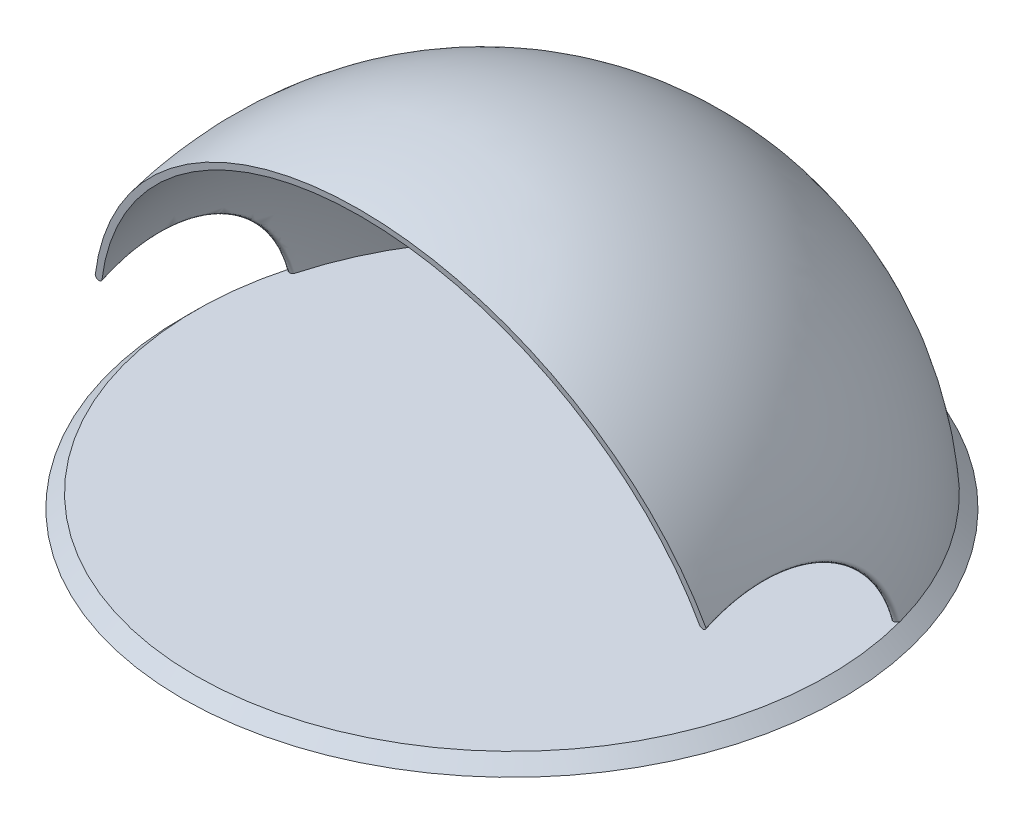
ISO-10303-21;
HEADER;
FILE_DESCRIPTION(('STEP AP214'),'2;1');
FILE_NAME('part.step','',(''),(''),'','','');
FILE_SCHEMA(('AUTOMOTIVE_DESIGN { 1 0 10303 214 1 1 1 1 }'));
ENDSEC;
DATA;
#1=APPLICATION_CONTEXT('core data for automotive mechanical design processes');
#2=APPLICATION_PROTOCOL_DEFINITION('international standard','automotive_design',2000,#1);
#3=PRODUCT_CONTEXT('',#1,'mechanical');
#4=PRODUCT('Part','Part','',(#3));
#5=PRODUCT_RELATED_PRODUCT_CATEGORY('part','',(#4));
#6=PRODUCT_DEFINITION_FORMATION('','',#4);
#7=PRODUCT_DEFINITION_CONTEXT('part definition',#1,'design');
#8=PRODUCT_DEFINITION('design','',#6,#7);
#9=PRODUCT_DEFINITION_SHAPE('','',#8);
#10=(LENGTH_UNIT() NAMED_UNIT(*) SI_UNIT(.MILLI.,.METRE.));
#11=(NAMED_UNIT(*) PLANE_ANGLE_UNIT() SI_UNIT($,.RADIAN.));
#12=(NAMED_UNIT(*) SI_UNIT($,.STERADIAN.) SOLID_ANGLE_UNIT());
#13=UNCERTAINTY_MEASURE_WITH_UNIT(LENGTH_MEASURE(1.E-05),#10,'distance_accuracy_value','');
#14=(GEOMETRIC_REPRESENTATION_CONTEXT(3) GLOBAL_UNCERTAINTY_ASSIGNED_CONTEXT((#13)) GLOBAL_UNIT_ASSIGNED_CONTEXT((#10,
#11,#12)) REPRESENTATION_CONTEXT('',''));
#15=CARTESIAN_POINT('',(0.,0.,0.));
#16=DIRECTION('',(0.,0.,1.));
#17=DIRECTION('',(1.,0.,0.));
#18=AXIS2_PLACEMENT_3D('',#15,#16,#17);
#19=CARTESIAN_POINT('',(0.,20.,0.));
#20=DIRECTION('',(0.,1.,0.));
#21=DIRECTION('',(0.,0.,1.));
#22=AXIS2_PLACEMENT_3D('',#19,#20,#21);
#23=PLANE('',#22);
#24=CARTESIAN_POINT('',(-458.072342239549,20.,-125.677083333333));
#25=DIRECTION('',(0.,1.,0.));
#26=DIRECTION('',(0.,0.,1.));
#27=AXIS2_PLACEMENT_3D('',#24,#25,#26);
#28=CIRCLE('',#27,5.00000000000003);
#29=CARTESIAN_POINT('',(-462.894156368386,20.,-127.));
#30=VERTEX_POINT('',#29);
#31=CARTESIAN_POINT('',(-453.250528110711,20.,-124.354166666667));
#32=VERTEX_POINT('',#31);
#33=EDGE_CURVE('E52',#30,#32,#28,.T.);
#34=ORIENTED_EDGE('',*,*,#33,.F.);
#35=CARTESIAN_POINT('',(0.,20.,0.));
#36=DIRECTION('',(0.,1.,0.));
#37=DIRECTION('',(0.,0.,1.));
#38=AXIS2_PLACEMENT_3D('',#35,#36,#37);
#39=CIRCLE('',#38,480.);
#40=CARTESIAN_POINT('',(462.894156368386,20.,-127.));
#41=VERTEX_POINT('',#40);
#42=EDGE_CURVE('E41',#30,#41,#39,.T.);
#43=ORIENTED_EDGE('',*,*,#42,.T.);
#44=CARTESIAN_POINT('',(458.072342239549,20.,-125.677083333333));
#45=DIRECTION('',(0.,1.,0.));
#46=DIRECTION('',(0.,0.,-1.));
#47=AXIS2_PLACEMENT_3D('',#44,#45,#46);
#48=CIRCLE('',#47,5.00000000000001);
#49=CARTESIAN_POINT('',(453.250528110711,20.,-124.354166666667));
#50=VERTEX_POINT('',#49);
#51=EDGE_CURVE('E88',#50,#41,#48,.T.);
#52=ORIENTED_EDGE('',*,*,#51,.F.);
#53=CARTESIAN_POINT('',(0.,20.,0.));
#54=DIRECTION('',(0.,-1.,0.));
#55=DIRECTION('',(0.,0.,-1.));
#56=AXIS2_PLACEMENT_3D('',#53,#54,#55);
#57=CIRCLE('',#56,470.);
#58=EDGE_CURVE('E48',#32,#50,#57,.T.);
#59=ORIENTED_EDGE('',*,*,#58,.F.);
#60=EDGE_LOOP('',(#34,#43,#52,#59));
#61=FACE_BOUND('',#60,.T.);
#62=ADVANCED_FACE('F33',(#61),#23,.T.);
#63=CARTESIAN_POINT('',(0.,0.,0.));
#64=DIRECTION('',(0.,-1.,0.));
#65=DIRECTION('',(0.,0.,1.));
#66=AXIS2_PLACEMENT_3D('',#63,#64,#65);
#67=CONICAL_SURFACE('',#66,500.,0.78539816339745);
#68=EDGE_CURVE('E11',#41,#30,#39,.T.);
#69=ORIENTED_EDGE('',*,*,#68,.F.);
#70=ORIENTED_EDGE('',*,*,#42,.F.);
#71=EDGE_LOOP('',(#69,#70));
#72=FACE_BOUND('',#71,.T.);
#73=CARTESIAN_POINT('',(0.,0.,0.));
#74=DIRECTION('',(0.,1.,0.));
#75=DIRECTION('',(0.,0.,1.));
#76=AXIS2_PLACEMENT_3D('',#73,#74,#75);
#77=CIRCLE('',#76,500.);
#78=CARTESIAN_POINT('',(0.,0.,500.));
#79=VERTEX_POINT('',#78);
#80=EDGE_CURVE('E83',#79,#79,#77,.T.);
#81=ORIENTED_EDGE('',*,*,#80,.T.);
#82=EDGE_LOOP('',(#81));
#83=FACE_BOUND('',#82,.T.);
#84=ADVANCED_FACE('F35',(#72,#83),#67,.T.);
#85=CARTESIAN_POINT('',(0.,0.,0.));
#86=DIRECTION('',(0.,1.,0.));
#87=DIRECTION('',(0.,0.,1.));
#88=AXIS2_PLACEMENT_3D('',#85,#86,#87);
#89=PLANE('',#88);
#90=ORIENTED_EDGE('',*,*,#80,.F.);
#91=EDGE_LOOP('',(#90));
#92=FACE_BOUND('',#91,.T.);
#93=ADVANCED_FACE('F101',(#92),#89,.F.);
#94=CARTESIAN_POINT('',(-229.036171119774,97.2845311127282,157.975073628956));
#95=DIRECTION('',(0.,-0.175115064149623,0.984547974609604));
#96=DIRECTION('',(0.,-0.984547974609604,-0.175115064149623));
#97=AXIS2_PLACEMENT_3D('',#94,#95,#96);
#98=PLANE('',#97);
#99=CARTESIAN_POINT('',(-458.072342239549,159.152090038066,168.979048883984));
#100=DIRECTION('',(0.,-0.175115064149623,0.984547974609604));
#101=DIRECTION('',(0.,-0.984547974609604,-0.175115064149623));
#102=AXIS2_PLACEMENT_3D('',#99,#100,#101);
#103=CIRCLE('',#102,5.00000000000003);
#104=CARTESIAN_POINT('',(-462.894156368386,160.45456496281,169.210711520932));
#105=VERTEX_POINT('',#104);
#106=CARTESIAN_POINT('',(-453.250528110711,157.849615113322,168.747386247036));
#107=VERTEX_POINT('',#106);
#108=EDGE_CURVE('E82',#105,#107,#103,.T.);
#109=ORIENTED_EDGE('',*,*,#108,.T.);
#110=CARTESIAN_POINT('',(0.,35.4169721873903,146.971098373929));
#111=DIRECTION('',(0.,0.175115064149623,-0.984547974609604));
#112=DIRECTION('',(0.,0.984547974609604,0.175115064149623));
#113=AXIS2_PLACEMENT_3D('',#110,#111,#112);
#114=CIRCLE('',#113,470.);
#115=CARTESIAN_POINT('',(453.250528110711,157.849615113322,168.747386247036));
#116=VERTEX_POINT('',#115);
#117=EDGE_CURVE('E77',#107,#116,#114,.T.);
#118=ORIENTED_EDGE('',*,*,#117,.T.);
#119=CARTESIAN_POINT('',(458.072342239549,159.152090038066,168.979048883984));
#120=DIRECTION('',(0.,-0.175115064149623,0.984547974609604));
#121=DIRECTION('',(0.,0.984547974609604,0.175115064149623));
#122=AXIS2_PLACEMENT_3D('',#119,#120,#121);
#123=CIRCLE('',#122,5.00000000000001);
#124=CARTESIAN_POINT('',(462.894156368386,160.45456496281,169.210711520932));
#125=VERTEX_POINT('',#124);
#126=EDGE_CURVE('E71',#116,#125,#123,.T.);
#127=ORIENTED_EDGE('',*,*,#126,.T.);
#128=CARTESIAN_POINT('',(0.,35.4169721873903,146.971098373929));
#129=DIRECTION('',(0.,-0.175115064149623,0.984547974609604));
#130=DIRECTION('',(0.,0.984547974609604,0.175115064149623));
#131=AXIS2_PLACEMENT_3D('',#128,#129,#130);
#132=CIRCLE('',#131,480.);
#133=EDGE_CURVE('E74',#125,#105,#132,.T.);
#134=ORIENTED_EDGE('',*,*,#133,.T.);
#135=EDGE_LOOP('',(#109,#118,#127,#134));
#136=FACE_BOUND('',#135,.T.);
#137=ADVANCED_FACE('F73',(#136),#98,.T.);
#138=CARTESIAN_POINT('',(462.894156368386,20.,-127.));
#139=CARTESIAN_POINT('',(462.894156368386,158.876701657731,-90.8554399731509));
#140=CARTESIAN_POINT('',(462.894156368386,220.360020850081,38.8093931311122));
#141=CARTESIAN_POINT('',(462.894156368386,160.45456496281,169.210711520932));
#142=CARTESIAN_POINT('',(302.710075009299,20.,-710.844686648501));
#143=CARTESIAN_POINT('',(302.710075009299,550.685309412867,-674.700126621652));
#144=CARTESIAN_POINT('',(302.710075009299,863.794714057857,-244.704978312947));
#145=CARTESIAN_POINT('',(302.710075009299,735.277668689171,271.450711276801));
#146=CARTESIAN_POINT('',(-302.710075009299,20.,-710.844686648501));
#147=CARTESIAN_POINT('',(-302.710075009299,550.685309412867,-674.700126621652));
#148=CARTESIAN_POINT('',(-302.710075009299,863.794714057857,-244.704978312947));
#149=CARTESIAN_POINT('',(-302.710075009299,735.277668689171,271.450711276801));
#150=CARTESIAN_POINT('',(-462.894156368386,20.,-127.));
#151=CARTESIAN_POINT('',(-462.894156368386,158.876701657731,-90.8554399731509));
#152=CARTESIAN_POINT('',(-462.894156368386,220.360020850081,38.8093931311122));
#153=CARTESIAN_POINT('',(-462.894156368386,160.45456496281,169.210711520932));
#154=CARTESIAN_POINT('',(-465.539989701719,20.,-117.356371742326));
#155=CARTESIAN_POINT('',(-465.539989701719,152.405020664901,-81.2118117154765));
#156=CARTESIAN_POINT('',(-465.539989701719,209.732117348884,43.492328963944));
#157=CARTESIAN_POINT('',(-465.539989701719,150.959950293829,167.521966939954));
#158=CARTESIAN_POINT('',(-455.896361444045,20.,-114.710538408992));
#159=CARTESIAN_POINT('',(-455.896361444045,150.629445244945,-78.5659783821432));
#160=CARTESIAN_POINT('',(-455.896361444045,206.816237495828,44.7771428735332));
#161=CARTESIAN_POINT('',(-455.896361444045,148.355000444341,167.058641666058));
#162=CARTESIAN_POINT('',(-453.250528110711,20.,-124.354166666667));
#163=CARTESIAN_POINT('',(-453.250528110711,157.101126237774,-88.2096066398176));
#164=CARTESIAN_POINT('',(-453.250528110711,217.444140997025,40.0942070407014));
#165=CARTESIAN_POINT('',(-453.250528110711,157.849615113322,168.747386247036));
#166=CARTESIAN_POINT('',(-296.403615113272,20.,-696.035422343324));
#167=CARTESIAN_POINT('',(-296.403615113272,540.747054664678,-659.890862316475));
#168=CARTESIAN_POINT('',(-296.403615113272,847.473944762972,-237.513614998273));
#169=CARTESIAN_POINT('',(-296.403615113272,720.69723751205,268.857386007991));
#170=CARTESIAN_POINT('',(296.403615113272,20.,-696.035422343324));
#171=CARTESIAN_POINT('',(296.403615113272,540.747054664678,-659.890862316475));
#172=CARTESIAN_POINT('',(296.403615113272,847.473944762972,-237.513614998274));
#173=CARTESIAN_POINT('',(296.403615113272,720.69723751205,268.857386007991));
#174=CARTESIAN_POINT('',(453.250528110711,20.,-124.354166666667));
#175=CARTESIAN_POINT('',(453.250528110711,157.101126237774,-88.2096066398176));
#176=CARTESIAN_POINT('',(453.250528110711,217.444140997025,40.0942070407013));
#177=CARTESIAN_POINT('',(453.250528110711,157.849615113322,168.747386247036));
#178=CARTESIAN_POINT('',(455.896361444045,20.,-114.710538408992));
#179=CARTESIAN_POINT('',(455.896361444045,150.629445244944,-78.5659783821428));
#180=CARTESIAN_POINT('',(455.896361444045,206.816237495828,44.7771428735334));
#181=CARTESIAN_POINT('',(455.896361444045,148.35500044434,167.058641666058));
#182=CARTESIAN_POINT('',(465.53998970172,20.,-117.356371742325));
#183=CARTESIAN_POINT('',(465.53998970172,152.405020664901,-81.2118117154762));
#184=CARTESIAN_POINT('',(465.53998970172,209.732117348884,43.4923289639441));
#185=CARTESIAN_POINT('',(465.53998970172,150.959950293828,167.521966939954));
#186=CARTESIAN_POINT('',(462.894156368386,20.,-127.));
#187=CARTESIAN_POINT('',(462.894156368386,158.876701657731,-90.855439973151));
#188=CARTESIAN_POINT('',(462.894156368386,220.360020850081,38.8093931311121));
#189=CARTESIAN_POINT('',(462.894156368386,160.45456496281,169.210711520932));
#190=(BOUNDED_SURFACE() B_SPLINE_SURFACE(3,3,((#138,#139,#140,#141),(#142,#143,#144,#145),(#146,
#147,#148,#149),(#150,#151,#152,#153),(#154,#155,#156,#157),(#158,#159,#160,#161),(#162,#163,
#164,#165),(#166,#167,#168,#169),(#170,#171,#172,#173),(#174,#175,#176,#177),(#178,#179,#180,
#181),(#182,#183,#184,#185),(#186,#187,#188,#189)),.UNSPECIFIED.,.T.,.F.,
.F.) B_SPLINE_SURFACE_WITH_KNOTS((4,3,3,3,4),(4,4),(0.,0.498931972554073,0.505197208047438,
0.993734764506635,1.),(0.,1.),
.UNSPECIFIED.) GEOMETRIC_REPRESENTATION_ITEM() RATIONAL_B_SPLINE_SURFACE(((1.,0.761477892474642,
0.761477892474642,1.),(0.509722222222222,0.388142203525269,0.388142203525269,0.509722222222222),
(0.509722222222222,0.388142203525269,0.388142203525269,0.509722222222222),(1.,0.761477892474642,
0.761477892474642,1.),(0.333333333333347,0.253825964158224,0.253825964158224,0.333333333333347),
(0.333333333333347,0.253825964158224,0.253825964158224,0.333333333333347),(1.,0.761477892474642,
0.761477892474642,1.),(0.509722222222222,0.388142203525269,0.388142203525269,0.509722222222222),
(0.509722222222222,0.388142203525269,0.388142203525269,0.509722222222222),(1.,0.761477892474642,
0.761477892474642,1.),(0.333333333333332,0.253825964158213,0.253825964158213,0.333333333333332),
(0.333333333333332,0.253825964158213,0.253825964158213,0.333333333333332),(1.,0.761477892474642,
0.761477892474642,1.))) REPRESENTATION_ITEM('') SURFACE());
#191=ORIENTED_EDGE('',*,*,#133,.F.);
#192=ORIENTED_EDGE('',*,*,#126,.F.);
#193=ORIENTED_EDGE('',*,*,#117,.F.);
#194=ORIENTED_EDGE('',*,*,#108,.F.);
#195=EDGE_LOOP('',(#191,#192,#193,#194));
#196=FACE_BOUND('',#195,.T.);
#197=ORIENTED_EDGE('',*,*,#68,.T.);
#198=ORIENTED_EDGE('',*,*,#33,.T.);
#199=ORIENTED_EDGE('',*,*,#58,.T.);
#200=ORIENTED_EDGE('',*,*,#51,.T.);
#201=EDGE_LOOP('',(#197,#198,#199,#200));
#202=FACE_BOUND('',#201,.T.);
#203=ADVANCED_FACE('F80',(#196,#202),#190,.T.);
#204=CLOSED_SHELL('',(#62,#84,#93,#137,#203));
#205=MANIFOLD_SOLID_BREP('B2',#204);
#206=ADVANCED_BREP_SHAPE_REPRESENTATION('',(#18,#205),#14);
#207=SHAPE_DEFINITION_REPRESENTATION(#9,#206);
ENDSEC;
END-ISO-10303-21;
